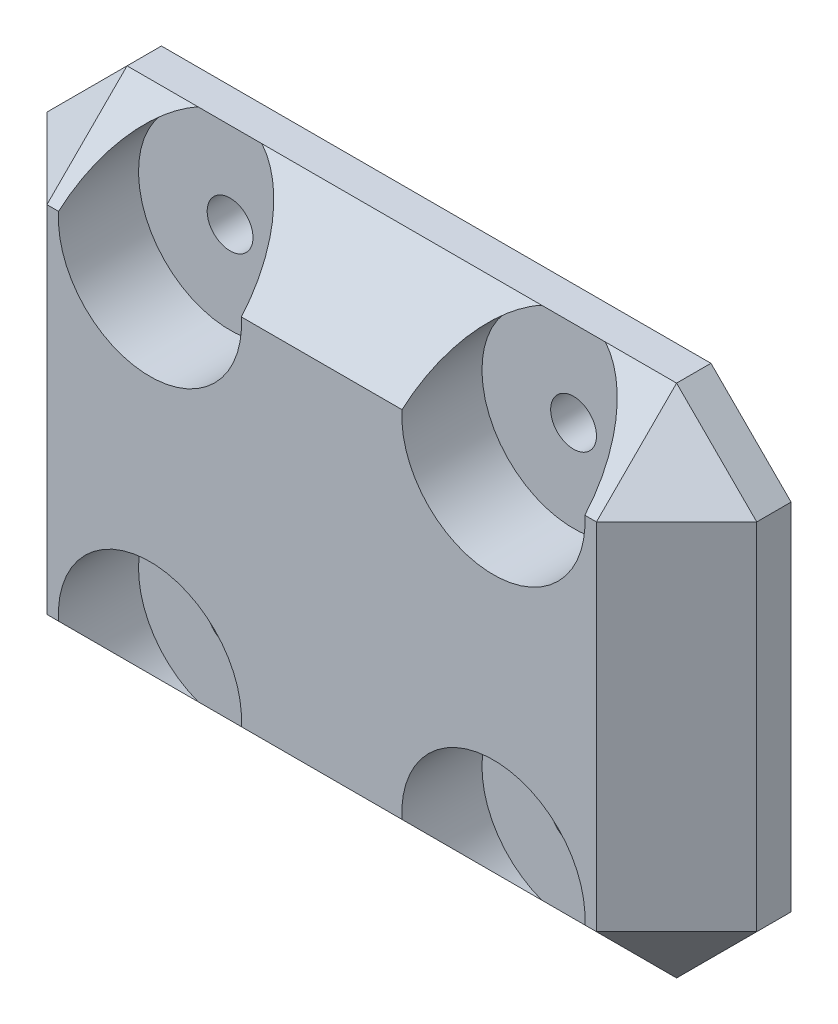
ISO-10303-21;
HEADER;
FILE_DESCRIPTION(('STEP AP214'),'2;1');
FILE_NAME('part.step','',(''),(''),'','','');
FILE_SCHEMA(('AUTOMOTIVE_DESIGN { 1 0 10303 214 1 1 1 1 }'));
ENDSEC;
DATA;
#1=APPLICATION_CONTEXT('core data for automotive mechanical design processes');
#2=APPLICATION_PROTOCOL_DEFINITION('international standard','automotive_design',2000,#1);
#3=PRODUCT_CONTEXT('',#1,'mechanical');
#4=PRODUCT('Part','Part','',(#3));
#5=PRODUCT_RELATED_PRODUCT_CATEGORY('part','',(#4));
#6=PRODUCT_DEFINITION_FORMATION('','',#4);
#7=PRODUCT_DEFINITION_CONTEXT('part definition',#1,'design');
#8=PRODUCT_DEFINITION('design','',#6,#7);
#9=PRODUCT_DEFINITION_SHAPE('','',#8);
#10=(LENGTH_UNIT() NAMED_UNIT(*) SI_UNIT(.MILLI.,.METRE.));
#11=(NAMED_UNIT(*) PLANE_ANGLE_UNIT() SI_UNIT($,.RADIAN.));
#12=(NAMED_UNIT(*) SI_UNIT($,.STERADIAN.) SOLID_ANGLE_UNIT());
#13=UNCERTAINTY_MEASURE_WITH_UNIT(LENGTH_MEASURE(1.E-05),#10,'distance_accuracy_value','');
#14=(GEOMETRIC_REPRESENTATION_CONTEXT(3) GLOBAL_UNCERTAINTY_ASSIGNED_CONTEXT((#13)) GLOBAL_UNIT_ASSIGNED_CONTEXT((#10,
#11,#12)) REPRESENTATION_CONTEXT('',''));
#15=CARTESIAN_POINT('',(0.,0.,0.));
#16=DIRECTION('',(0.,0.,1.));
#17=DIRECTION('',(1.,0.,0.));
#18=AXIS2_PLACEMENT_3D('',#15,#16,#17);
#19=CARTESIAN_POINT('',(-15.,-15.,10.));
#20=DIRECTION('',(0.,0.,-1.));
#21=DIRECTION('',(-1.,0.,0.));
#22=AXIS2_PLACEMENT_3D('',#19,#20,#21);
#23=CYLINDRICAL_SURFACE('',#22,2.);
#24=CARTESIAN_POINT('',(-15.,-15.,0.));
#25=DIRECTION('',(0.,0.,1.));
#26=DIRECTION('',(1.,0.,0.));
#27=AXIS2_PLACEMENT_3D('',#24,#25,#26);
#28=CIRCLE('',#27,2.);
#29=CARTESIAN_POINT('',(-13.,-15.,0.));
#30=VERTEX_POINT('',#29);
#31=EDGE_CURVE('E325',#30,#30,#28,.T.);
#32=ORIENTED_EDGE('',*,*,#31,.F.);
#33=EDGE_LOOP('',(#32));
#34=FACE_BOUND('',#33,.T.);
#35=CARTESIAN_POINT('',(-15.,-15.,3.));
#36=DIRECTION('',(0.,0.,1.));
#37=DIRECTION('',(1.,0.,0.));
#38=AXIS2_PLACEMENT_3D('',#35,#36,#37);
#39=CIRCLE('',#38,2.);
#40=CARTESIAN_POINT('',(-13.,-15.,3.));
#41=VERTEX_POINT('',#40);
#42=EDGE_CURVE('E304',#41,#41,#39,.T.);
#43=ORIENTED_EDGE('',*,*,#42,.T.);
#44=EDGE_LOOP('',(#43));
#45=FACE_BOUND('',#44,.T.);
#46=ADVANCED_FACE('F33',(#34,#45),#23,.F.);
#47=CARTESIAN_POINT('',(-15.,15.,10.));
#48=DIRECTION('',(0.,0.,-1.));
#49=DIRECTION('',(-1.,0.,0.));
#50=AXIS2_PLACEMENT_3D('',#47,#48,#49);
#51=CYLINDRICAL_SURFACE('',#50,2.);
#52=CARTESIAN_POINT('',(-15.,15.,0.));
#53=DIRECTION('',(0.,0.,1.));
#54=DIRECTION('',(1.,0.,0.));
#55=AXIS2_PLACEMENT_3D('',#52,#53,#54);
#56=CIRCLE('',#55,2.);
#57=CARTESIAN_POINT('',(-13.,15.,0.));
#58=VERTEX_POINT('',#57);
#59=EDGE_CURVE('E322',#58,#58,#56,.T.);
#60=ORIENTED_EDGE('',*,*,#59,.F.);
#61=EDGE_LOOP('',(#60));
#62=FACE_BOUND('',#61,.T.);
#63=CARTESIAN_POINT('',(-15.,15.,3.));
#64=DIRECTION('',(0.,0.,1.));
#65=DIRECTION('',(1.,0.,0.));
#66=AXIS2_PLACEMENT_3D('',#63,#64,#65);
#67=CIRCLE('',#66,2.);
#68=CARTESIAN_POINT('',(-13.,15.,3.));
#69=VERTEX_POINT('',#68);
#70=EDGE_CURVE('E312',#69,#69,#67,.T.);
#71=ORIENTED_EDGE('',*,*,#70,.T.);
#72=EDGE_LOOP('',(#71));
#73=FACE_BOUND('',#72,.T.);
#74=ADVANCED_FACE('F440',(#62,#73),#51,.F.);
#75=CARTESIAN_POINT('',(15.,15.,10.));
#76=DIRECTION('',(0.,0.,-1.));
#77=DIRECTION('',(-1.,0.,0.));
#78=AXIS2_PLACEMENT_3D('',#75,#76,#77);
#79=CYLINDRICAL_SURFACE('',#78,2.);
#80=CARTESIAN_POINT('',(15.,15.,0.));
#81=DIRECTION('',(0.,0.,1.));
#82=DIRECTION('',(1.,0.,0.));
#83=AXIS2_PLACEMENT_3D('',#80,#81,#82);
#84=CIRCLE('',#83,2.);
#85=CARTESIAN_POINT('',(17.,15.,0.));
#86=VERTEX_POINT('',#85);
#87=EDGE_CURVE('E319',#86,#86,#84,.T.);
#88=ORIENTED_EDGE('',*,*,#87,.F.);
#89=EDGE_LOOP('',(#88));
#90=FACE_BOUND('',#89,.T.);
#91=CARTESIAN_POINT('',(15.,15.,3.));
#92=DIRECTION('',(0.,0.,1.));
#93=DIRECTION('',(1.,0.,0.));
#94=AXIS2_PLACEMENT_3D('',#91,#92,#93);
#95=CIRCLE('',#94,2.);
#96=CARTESIAN_POINT('',(17.,15.,3.));
#97=VERTEX_POINT('',#96);
#98=EDGE_CURVE('E237',#97,#97,#95,.T.);
#99=ORIENTED_EDGE('',*,*,#98,.T.);
#100=EDGE_LOOP('',(#99));
#101=FACE_BOUND('',#100,.T.);
#102=ADVANCED_FACE('F446',(#90,#101),#79,.F.);
#103=CARTESIAN_POINT('',(15.,-15.,10.));
#104=DIRECTION('',(0.,0.,-1.));
#105=DIRECTION('',(-1.,0.,0.));
#106=AXIS2_PLACEMENT_3D('',#103,#104,#105);
#107=CYLINDRICAL_SURFACE('',#106,2.);
#108=CARTESIAN_POINT('',(15.,-15.,0.));
#109=DIRECTION('',(0.,0.,1.));
#110=DIRECTION('',(1.,0.,0.));
#111=AXIS2_PLACEMENT_3D('',#108,#109,#110);
#112=CIRCLE('',#111,2.);
#113=CARTESIAN_POINT('',(17.,-15.,0.));
#114=VERTEX_POINT('',#113);
#115=EDGE_CURVE('E268',#114,#114,#112,.T.);
#116=ORIENTED_EDGE('',*,*,#115,.F.);
#117=EDGE_LOOP('',(#116));
#118=FACE_BOUND('',#117,.T.);
#119=CARTESIAN_POINT('',(15.,-15.,3.));
#120=DIRECTION('',(0.,0.,1.));
#121=DIRECTION('',(1.,0.,0.));
#122=AXIS2_PLACEMENT_3D('',#119,#120,#121);
#123=CIRCLE('',#122,2.);
#124=CARTESIAN_POINT('',(17.,-15.,3.));
#125=VERTEX_POINT('',#124);
#126=EDGE_CURVE('E309',#125,#125,#123,.T.);
#127=ORIENTED_EDGE('',*,*,#126,.T.);
#128=EDGE_LOOP('',(#127));
#129=FACE_BOUND('',#128,.T.);
#130=ADVANCED_FACE('F494',(#118,#129),#107,.F.);
#131=CARTESIAN_POINT('',(0.,15.5,10.));
#132=DIRECTION('',(0.,-0.707106781186546,-0.707106781186549));
#133=DIRECTION('',(-1.,0.,0.));
#134=AXIS2_PLACEMENT_3D('',#131,#132,#133);
#135=PLANE('',#134);
#136=CARTESIAN_POINT('',(15.,15.,10.5));
#137=DIRECTION('',(0.,-0.707106781186546,-0.707106781186549));
#138=DIRECTION('',(0.,-0.707106781186549,0.707106781186546));
#139=AXIS2_PLACEMENT_3D('',#136,#137,#138);
#140=ELLIPSE('',#139,11.3137084989847,8.);
#141=CARTESIAN_POINT('',(22.9843597113357,15.5,10.));
#142=VERTEX_POINT('',#141);
#143=CARTESIAN_POINT('',(17.783882181415,22.5,3.00000000000001));
#144=VERTEX_POINT('',#143);
#145=EDGE_CURVE('E11',#142,#144,#140,.F.);
#146=ORIENTED_EDGE('',*,*,#145,.F.);
#147=DIRECTION('',(-1.,0.,0.));
#148=VECTOR('',#147,1.);
#149=CARTESIAN_POINT('',(0.,15.5,10.));
#150=LINE('',#149,#148);
#151=CARTESIAN_POINT('',(24.,15.5,10.));
#152=VERTEX_POINT('',#151);
#153=EDGE_CURVE('E342',#152,#142,#150,.T.);
#154=ORIENTED_EDGE('',*,*,#153,.F.);
#155=DIRECTION('',(0.,0.707106781186549,-0.707106781186546));
#156=VECTOR('',#155,1.);
#157=CARTESIAN_POINT('',(24.,22.5,3.00000000000001));
#158=LINE('',#157,#156);
#159=CARTESIAN_POINT('',(24.,22.5,3.00000000000001));
#160=VERTEX_POINT('',#159);
#161=EDGE_CURVE('E260',#160,#152,#158,.F.);
#162=ORIENTED_EDGE('',*,*,#161,.F.);
#163=DIRECTION('',(1.,0.,0.));
#164=VECTOR('',#163,1.);
#165=CARTESIAN_POINT('',(-31.,22.5,3.00000000000001));
#166=LINE('',#165,#164);
#167=EDGE_CURVE('E220',#144,#160,#166,.T.);
#168=ORIENTED_EDGE('',*,*,#167,.F.);
#169=EDGE_LOOP('',(#146,#154,#162,#168));
#170=FACE_BOUND('',#169,.T.);
#171=ADVANCED_FACE('F395',(#170),#135,.F.);
#172=CARTESIAN_POINT('',(12.216117818585,22.5,3.));
#173=VERTEX_POINT('',#172);
#174=CARTESIAN_POINT('',(7.01564028866434,15.5,10.));
#175=VERTEX_POINT('',#174);
#176=EDGE_CURVE('E37',#173,#175,#140,.F.);
#177=ORIENTED_EDGE('',*,*,#176,.F.);
#178=CARTESIAN_POINT('',(-12.216117818585,22.5,3.00000000000001));
#179=VERTEX_POINT('',#178);
#180=EDGE_CURVE('E416',#179,#173,#166,.T.);
#181=ORIENTED_EDGE('',*,*,#180,.F.);
#182=CARTESIAN_POINT('',(-15.,15.,10.5));
#183=DIRECTION('',(0.,-0.707106781186546,-0.707106781186549));
#184=DIRECTION('',(0.,-0.707106781186549,0.707106781186546));
#185=AXIS2_PLACEMENT_3D('',#182,#183,#184);
#186=ELLIPSE('',#185,11.3137084989847,8.);
#187=CARTESIAN_POINT('',(-7.01564028866434,15.5,10.));
#188=VERTEX_POINT('',#187);
#189=EDGE_CURVE('E272',#188,#179,#186,.F.);
#190=ORIENTED_EDGE('',*,*,#189,.F.);
#191=DIRECTION('',(-1.,0.,0.));
#192=VECTOR('',#191,1.);
#193=CARTESIAN_POINT('',(0.,15.5,10.));
#194=LINE('',#193,#192);
#195=EDGE_CURVE('E186',#175,#188,#194,.T.);
#196=ORIENTED_EDGE('',*,*,#195,.F.);
#197=EDGE_LOOP('',(#177,#181,#190,#196));
#198=FACE_BOUND('',#197,.T.);
#199=ADVANCED_FACE('F424',(#198),#135,.F.);
#200=CARTESIAN_POINT('',(0.,-15.5,10.));
#201=DIRECTION('',(0.,0.707106781186549,-0.707106781186546));
#202=DIRECTION('',(1.,0.,0.));
#203=AXIS2_PLACEMENT_3D('',#200,#201,#202);
#204=PLANE('',#203);
#205=CARTESIAN_POINT('',(15.,-15.,10.5));
#206=DIRECTION('',(0.,0.707106781186549,-0.707106781186546));
#207=DIRECTION('',(0.,0.707106781186546,0.707106781186549));
#208=AXIS2_PLACEMENT_3D('',#205,#206,#207);
#209=ELLIPSE('',#208,11.3137084989848,8.);
#210=CARTESIAN_POINT('',(7.01564028866435,-15.5,10.));
#211=VERTEX_POINT('',#210);
#212=CARTESIAN_POINT('',(12.2161178185849,-22.5,2.99999999999999));
#213=VERTEX_POINT('',#212);
#214=EDGE_CURVE('E270',#211,#213,#209,.F.);
#215=ORIENTED_EDGE('',*,*,#214,.F.);
#216=DIRECTION('',(1.,0.,0.));
#217=VECTOR('',#216,1.);
#218=CARTESIAN_POINT('',(0.,-15.5,10.));
#219=LINE('',#218,#217);
#220=CARTESIAN_POINT('',(-7.01564028866434,-15.5,10.));
#221=VERTEX_POINT('',#220);
#222=EDGE_CURVE('E189',#221,#211,#219,.T.);
#223=ORIENTED_EDGE('',*,*,#222,.F.);
#224=CARTESIAN_POINT('',(-15.,-15.,10.5));
#225=DIRECTION('',(0.,0.707106781186549,-0.707106781186546));
#226=DIRECTION('',(0.,0.707106781186546,0.707106781186549));
#227=AXIS2_PLACEMENT_3D('',#224,#225,#226);
#228=ELLIPSE('',#227,11.3137084989848,8.);
#229=CARTESIAN_POINT('',(-12.2161178185849,-22.5,3.));
#230=VERTEX_POINT('',#229);
#231=EDGE_CURVE('E164',#230,#221,#228,.F.);
#232=ORIENTED_EDGE('',*,*,#231,.F.);
#233=DIRECTION('',(-1.,0.,0.));
#234=VECTOR('',#233,1.);
#235=CARTESIAN_POINT('',(-31.,-22.5,2.99999999999999));
#236=LINE('',#235,#234);
#237=EDGE_CURVE('E287',#213,#230,#236,.T.);
#238=ORIENTED_EDGE('',*,*,#237,.F.);
#239=EDGE_LOOP('',(#215,#223,#232,#238));
#240=FACE_BOUND('',#239,.T.);
#241=ADVANCED_FACE('F289',(#240),#204,.F.);
#242=CARTESIAN_POINT('',(-22.9843597113357,-15.5,10.));
#243=VERTEX_POINT('',#242);
#244=CARTESIAN_POINT('',(-17.7838821814151,-22.5,2.99999999999999));
#245=VERTEX_POINT('',#244);
#246=EDGE_CURVE('E161',#243,#245,#228,.F.);
#247=ORIENTED_EDGE('',*,*,#246,.F.);
#248=DIRECTION('',(1.,0.,0.));
#249=VECTOR('',#248,1.);
#250=CARTESIAN_POINT('',(0.,-15.5,10.));
#251=LINE('',#250,#249);
#252=CARTESIAN_POINT('',(-24.,-15.5,10.));
#253=VERTEX_POINT('',#252);
#254=EDGE_CURVE('E176',#253,#243,#251,.T.);
#255=ORIENTED_EDGE('',*,*,#254,.F.);
#256=DIRECTION('',(0.,-0.707106781186546,-0.707106781186549));
#257=VECTOR('',#256,1.);
#258=CARTESIAN_POINT('',(-24.,-22.5,2.99999999999999));
#259=LINE('',#258,#257);
#260=CARTESIAN_POINT('',(-24.,-22.5,2.99999999999999));
#261=VERTEX_POINT('',#260);
#262=EDGE_CURVE('E236',#253,#261,#259,.T.);
#263=ORIENTED_EDGE('',*,*,#262,.T.);
#264=EDGE_CURVE('E177',#245,#261,#236,.T.);
#265=ORIENTED_EDGE('',*,*,#264,.F.);
#266=EDGE_LOOP('',(#247,#255,#263,#265));
#267=FACE_BOUND('',#266,.T.);
#268=ADVANCED_FACE('F174',(#267),#204,.F.);
#269=CARTESIAN_POINT('',(0.,0.,10.));
#270=DIRECTION('',(0.,0.,-1.));
#271=DIRECTION('',(-1.,0.,0.));
#272=AXIS2_PLACEMENT_3D('',#269,#270,#271);
#273=PLANE('',#272);
#274=ORIENTED_EDGE('',*,*,#153,.T.);
#275=CARTESIAN_POINT('',(15.,15.,10.));
#276=DIRECTION('',(0.,0.,1.));
#277=DIRECTION('',(1.,0.,0.));
#278=AXIS2_PLACEMENT_3D('',#275,#276,#277);
#279=CIRCLE('',#278,8.);
#280=EDGE_CURVE('E301',#175,#142,#279,.T.);
#281=ORIENTED_EDGE('',*,*,#280,.F.);
#282=ORIENTED_EDGE('',*,*,#195,.T.);
#283=CARTESIAN_POINT('',(-15.,15.,10.));
#284=DIRECTION('',(0.,0.,1.));
#285=DIRECTION('',(1.,0.,0.));
#286=AXIS2_PLACEMENT_3D('',#283,#284,#285);
#287=CIRCLE('',#286,8.);
#288=CARTESIAN_POINT('',(-22.9843597113357,15.5,10.));
#289=VERTEX_POINT('',#288);
#290=EDGE_CURVE('E305',#289,#188,#287,.T.);
#291=ORIENTED_EDGE('',*,*,#290,.F.);
#292=DIRECTION('',(-1.,0.,0.));
#293=VECTOR('',#292,1.);
#294=CARTESIAN_POINT('',(0.,15.5,10.));
#295=LINE('',#294,#293);
#296=CARTESIAN_POINT('',(-24.,15.5,10.));
#297=VERTEX_POINT('',#296);
#298=EDGE_CURVE('E191',#289,#297,#295,.T.);
#299=ORIENTED_EDGE('',*,*,#298,.T.);
#300=DIRECTION('',(0.,-1.,0.));
#301=VECTOR('',#300,1.);
#302=CARTESIAN_POINT('',(-24.,0.,10.));
#303=LINE('',#302,#301);
#304=EDGE_CURVE('E184',#297,#253,#303,.T.);
#305=ORIENTED_EDGE('',*,*,#304,.T.);
#306=ORIENTED_EDGE('',*,*,#254,.T.);
#307=CARTESIAN_POINT('',(-15.,-15.,10.));
#308=DIRECTION('',(0.,0.,1.));
#309=DIRECTION('',(1.,0.,0.));
#310=AXIS2_PLACEMENT_3D('',#307,#308,#309);
#311=CIRCLE('',#310,8.);
#312=EDGE_CURVE('E157',#221,#243,#311,.T.);
#313=ORIENTED_EDGE('',*,*,#312,.F.);
#314=ORIENTED_EDGE('',*,*,#222,.T.);
#315=CARTESIAN_POINT('',(15.,-15.,10.));
#316=DIRECTION('',(0.,0.,1.));
#317=DIRECTION('',(1.,0.,0.));
#318=AXIS2_PLACEMENT_3D('',#315,#316,#317);
#319=CIRCLE('',#318,8.);
#320=CARTESIAN_POINT('',(22.9843597113357,-15.5,10.));
#321=VERTEX_POINT('',#320);
#322=EDGE_CURVE('E284',#321,#211,#319,.T.);
#323=ORIENTED_EDGE('',*,*,#322,.F.);
#324=DIRECTION('',(1.,0.,0.));
#325=VECTOR('',#324,1.);
#326=CARTESIAN_POINT('',(0.,-15.5,10.));
#327=LINE('',#326,#325);
#328=CARTESIAN_POINT('',(24.,-15.5,10.));
#329=VERTEX_POINT('',#328);
#330=EDGE_CURVE('E344',#321,#329,#327,.T.);
#331=ORIENTED_EDGE('',*,*,#330,.T.);
#332=DIRECTION('',(0.,1.,0.));
#333=VECTOR('',#332,1.);
#334=CARTESIAN_POINT('',(24.,0.,10.));
#335=LINE('',#334,#333);
#336=EDGE_CURVE('E340',#329,#152,#335,.T.);
#337=ORIENTED_EDGE('',*,*,#336,.T.);
#338=EDGE_LOOP('',(#274,#281,#282,#291,#299,#305,#306,#313,#314,#323,#331,#337));
#339=FACE_BOUND('',#338,.T.);
#340=ADVANCED_FACE('F182',(#339),#273,.F.);
#341=CARTESIAN_POINT('',(0.,0.,0.));
#342=DIRECTION('',(0.,0.,-1.));
#343=DIRECTION('',(-1.,0.,0.));
#344=AXIS2_PLACEMENT_3D('',#341,#342,#343);
#345=PLANE('',#344);
#346=ORIENTED_EDGE('',*,*,#87,.T.);
#347=EDGE_LOOP('',(#346));
#348=FACE_BOUND('',#347,.T.);
#349=ORIENTED_EDGE('',*,*,#31,.T.);
#350=EDGE_LOOP('',(#349));
#351=FACE_BOUND('',#350,.T.);
#352=DIRECTION('',(1.,0.,0.));
#353=VECTOR('',#352,1.);
#354=CARTESIAN_POINT('',(-31.,-22.5,0.));
#355=LINE('',#354,#353);
#356=CARTESIAN_POINT('',(-24.,-22.5,0.));
#357=VERTEX_POINT('',#356);
#358=CARTESIAN_POINT('',(24.,-22.5,0.));
#359=VERTEX_POINT('',#358);
#360=EDGE_CURVE('E337',#357,#359,#355,.T.);
#361=ORIENTED_EDGE('',*,*,#360,.F.);
#362=DIRECTION('',(0.707106781186546,-0.707106781186549,0.));
#363=VECTOR('',#362,1.);
#364=CARTESIAN_POINT('',(-23.25,-23.25,0.));
#365=LINE('',#364,#363);
#366=CARTESIAN_POINT('',(-31.,-15.5,0.));
#367=VERTEX_POINT('',#366);
#368=EDGE_CURVE('E210',#357,#367,#365,.F.);
#369=ORIENTED_EDGE('',*,*,#368,.T.);
#370=DIRECTION('',(0.,-1.,0.));
#371=VECTOR('',#370,1.);
#372=CARTESIAN_POINT('',(-31.,-22.5,0.));
#373=LINE('',#372,#371);
#374=CARTESIAN_POINT('',(-31.,15.5,0.));
#375=VERTEX_POINT('',#374);
#376=EDGE_CURVE('E334',#375,#367,#373,.T.);
#377=ORIENTED_EDGE('',*,*,#376,.F.);
#378=DIRECTION('',(-0.707106781186546,-0.707106781186549,0.));
#379=VECTOR('',#378,1.);
#380=CARTESIAN_POINT('',(-23.25,23.25,0.));
#381=LINE('',#380,#379);
#382=CARTESIAN_POINT('',(-24.,22.5,0.));
#383=VERTEX_POINT('',#382);
#384=EDGE_CURVE('E208',#375,#383,#381,.F.);
#385=ORIENTED_EDGE('',*,*,#384,.T.);
#386=DIRECTION('',(-1.,0.,0.));
#387=VECTOR('',#386,1.);
#388=CARTESIAN_POINT('',(-31.,22.5,0.));
#389=LINE('',#388,#387);
#390=CARTESIAN_POINT('',(24.,22.5,0.));
#391=VERTEX_POINT('',#390);
#392=EDGE_CURVE('E331',#391,#383,#389,.T.);
#393=ORIENTED_EDGE('',*,*,#392,.F.);
#394=DIRECTION('',(-0.707106781186546,0.707106781186549,0.));
#395=VECTOR('',#394,1.);
#396=CARTESIAN_POINT('',(23.25,23.25,0.));
#397=LINE('',#396,#395);
#398=CARTESIAN_POINT('',(31.,15.5,0.));
#399=VERTEX_POINT('',#398);
#400=EDGE_CURVE('E204',#391,#399,#397,.F.);
#401=ORIENTED_EDGE('',*,*,#400,.T.);
#402=DIRECTION('',(0.,1.,0.));
#403=VECTOR('',#402,1.);
#404=CARTESIAN_POINT('',(31.,-22.5,0.));
#405=LINE('',#404,#403);
#406=CARTESIAN_POINT('',(31.,-15.5,0.));
#407=VERTEX_POINT('',#406);
#408=EDGE_CURVE('E328',#407,#399,#405,.T.);
#409=ORIENTED_EDGE('',*,*,#408,.F.);
#410=DIRECTION('',(0.707106781186546,0.707106781186549,0.));
#411=VECTOR('',#410,1.);
#412=CARTESIAN_POINT('',(23.25,-23.25,0.));
#413=LINE('',#412,#411);
#414=EDGE_CURVE('E206',#407,#359,#413,.F.);
#415=ORIENTED_EDGE('',*,*,#414,.T.);
#416=EDGE_LOOP('',(#361,#369,#377,#385,#393,#401,#409,#415));
#417=FACE_BOUND('',#416,.T.);
#418=ORIENTED_EDGE('',*,*,#59,.T.);
#419=EDGE_LOOP('',(#418));
#420=FACE_BOUND('',#419,.T.);
#421=ORIENTED_EDGE('',*,*,#115,.T.);
#422=EDGE_LOOP('',(#421));
#423=FACE_BOUND('',#422,.T.);
#424=ADVANCED_FACE('F369',(#348,#351,#417,#420,#423),#345,.T.);
#425=CARTESIAN_POINT('',(31.,-22.5,10.));
#426=DIRECTION('',(-1.,0.,0.));
#427=DIRECTION('',(0.,0.,1.));
#428=AXIS2_PLACEMENT_3D('',#425,#426,#427);
#429=PLANE('',#428);
#430=DIRECTION('',(0.,-1.,0.));
#431=VECTOR('',#430,1.);
#432=CARTESIAN_POINT('',(31.,-22.5,2.99999999999999));
#433=LINE('',#432,#431);
#434=CARTESIAN_POINT('',(31.,15.5,2.99999999999999));
#435=VERTEX_POINT('',#434);
#436=CARTESIAN_POINT('',(31.,-15.5,2.99999999999999));
#437=VERTEX_POINT('',#436);
#438=EDGE_CURVE('E229',#435,#437,#433,.T.);
#439=ORIENTED_EDGE('',*,*,#438,.T.);
#440=DIRECTION('',(0.,0.,-1.));
#441=VECTOR('',#440,1.);
#442=CARTESIAN_POINT('',(31.,-15.5,10.));
#443=LINE('',#442,#441);
#444=EDGE_CURVE('E231',#437,#407,#443,.T.);
#445=ORIENTED_EDGE('',*,*,#444,.T.);
#446=ORIENTED_EDGE('',*,*,#408,.T.);
#447=DIRECTION('',(0.,0.,1.));
#448=VECTOR('',#447,1.);
#449=CARTESIAN_POINT('',(31.,15.5,10.));
#450=LINE('',#449,#448);
#451=EDGE_CURVE('E227',#399,#435,#450,.T.);
#452=ORIENTED_EDGE('',*,*,#451,.T.);
#453=EDGE_LOOP('',(#439,#445,#446,#452));
#454=FACE_BOUND('',#453,.T.);
#455=ADVANCED_FACE('F457',(#454),#429,.F.);
#456=CARTESIAN_POINT('',(-31.,22.5,10.));
#457=DIRECTION('',(0.,-1.,0.));
#458=DIRECTION('',(0.,0.,-1.));
#459=AXIS2_PLACEMENT_3D('',#456,#457,#458);
#460=PLANE('',#459);
#461=ORIENTED_EDGE('',*,*,#392,.T.);
#462=DIRECTION('',(0.,0.,1.));
#463=VECTOR('',#462,1.);
#464=CARTESIAN_POINT('',(-24.,22.5,10.));
#465=LINE('',#464,#463);
#466=CARTESIAN_POINT('',(-24.,22.5,3.00000000000001));
#467=VERTEX_POINT('',#466);
#468=EDGE_CURVE('E224',#383,#467,#465,.T.);
#469=ORIENTED_EDGE('',*,*,#468,.T.);
#470=CARTESIAN_POINT('',(-17.783882181415,22.5,3.));
#471=VERTEX_POINT('',#470);
#472=EDGE_CURVE('E221',#467,#471,#166,.T.);
#473=ORIENTED_EDGE('',*,*,#472,.T.);
#474=EDGE_CURVE('E225',#471,#179,#166,.T.);
#475=ORIENTED_EDGE('',*,*,#474,.T.);
#476=ORIENTED_EDGE('',*,*,#180,.T.);
#477=EDGE_CURVE('E417',#173,#144,#166,.T.);
#478=ORIENTED_EDGE('',*,*,#477,.T.);
#479=ORIENTED_EDGE('',*,*,#167,.T.);
#480=DIRECTION('',(0.,0.,-1.));
#481=VECTOR('',#480,1.);
#482=CARTESIAN_POINT('',(24.,22.5,10.));
#483=LINE('',#482,#481);
#484=EDGE_CURVE('E218',#160,#391,#483,.T.);
#485=ORIENTED_EDGE('',*,*,#484,.T.);
#486=EDGE_LOOP('',(#461,#469,#473,#475,#476,#478,#479,#485));
#487=FACE_BOUND('',#486,.T.);
#488=ADVANCED_FACE('F407',(#487),#460,.F.);
#489=CARTESIAN_POINT('',(-31.,-22.5,10.));
#490=DIRECTION('',(1.,0.,0.));
#491=DIRECTION('',(0.,0.,-1.));
#492=AXIS2_PLACEMENT_3D('',#489,#490,#491);
#493=PLANE('',#492);
#494=ORIENTED_EDGE('',*,*,#376,.T.);
#495=DIRECTION('',(0.,0.,1.));
#496=VECTOR('',#495,1.);
#497=CARTESIAN_POINT('',(-31.,-15.5,10.));
#498=LINE('',#497,#496);
#499=CARTESIAN_POINT('',(-31.,-15.5,2.99999999999999));
#500=VERTEX_POINT('',#499);
#501=EDGE_CURVE('E216',#367,#500,#498,.T.);
#502=ORIENTED_EDGE('',*,*,#501,.T.);
#503=DIRECTION('',(0.,1.,0.));
#504=VECTOR('',#503,1.);
#505=CARTESIAN_POINT('',(-31.,-22.5,2.99999999999999));
#506=LINE('',#505,#504);
#507=CARTESIAN_POINT('',(-31.,15.5,2.99999999999999));
#508=VERTEX_POINT('',#507);
#509=EDGE_CURVE('E214',#500,#508,#506,.T.);
#510=ORIENTED_EDGE('',*,*,#509,.T.);
#511=DIRECTION('',(0.,0.,-1.));
#512=VECTOR('',#511,1.);
#513=CARTESIAN_POINT('',(-31.,15.5,10.));
#514=LINE('',#513,#512);
#515=EDGE_CURVE('E212',#508,#375,#514,.T.);
#516=ORIENTED_EDGE('',*,*,#515,.T.);
#517=EDGE_LOOP('',(#494,#502,#510,#516));
#518=FACE_BOUND('',#517,.T.);
#519=ADVANCED_FACE('F461',(#518),#493,.F.);
#520=CARTESIAN_POINT('',(-31.,-22.5,10.));
#521=DIRECTION('',(0.,1.,0.));
#522=DIRECTION('',(0.,0.,1.));
#523=AXIS2_PLACEMENT_3D('',#520,#521,#522);
#524=PLANE('',#523);
#525=CARTESIAN_POINT('',(24.,-22.5,2.99999999999999));
#526=VERTEX_POINT('',#525);
#527=CARTESIAN_POINT('',(17.7838821814151,-22.5,3.));
#528=VERTEX_POINT('',#527);
#529=EDGE_CURVE('E198',#526,#528,#236,.T.);
#530=ORIENTED_EDGE('',*,*,#529,.T.);
#531=EDGE_CURVE('E202',#528,#213,#236,.T.);
#532=ORIENTED_EDGE('',*,*,#531,.T.);
#533=ORIENTED_EDGE('',*,*,#237,.T.);
#534=EDGE_CURVE('E291',#230,#245,#236,.T.);
#535=ORIENTED_EDGE('',*,*,#534,.T.);
#536=ORIENTED_EDGE('',*,*,#264,.T.);
#537=DIRECTION('',(0.,0.,-1.));
#538=VECTOR('',#537,1.);
#539=CARTESIAN_POINT('',(-24.,-22.5,10.));
#540=LINE('',#539,#538);
#541=EDGE_CURVE('E201',#261,#357,#540,.T.);
#542=ORIENTED_EDGE('',*,*,#541,.T.);
#543=ORIENTED_EDGE('',*,*,#360,.T.);
#544=DIRECTION('',(0.,0.,1.));
#545=VECTOR('',#544,1.);
#546=CARTESIAN_POINT('',(24.,-22.5,10.));
#547=LINE('',#546,#545);
#548=EDGE_CURVE('E196',#359,#526,#547,.T.);
#549=ORIENTED_EDGE('',*,*,#548,.T.);
#550=EDGE_LOOP('',(#530,#532,#533,#535,#536,#542,#543,#549));
#551=FACE_BOUND('',#550,.T.);
#552=ADVANCED_FACE('F292',(#551),#524,.F.);
#553=CARTESIAN_POINT('',(-31.,15.5,10.));
#554=DIRECTION('',(0.707106781186549,-0.707106781186546,0.));
#555=DIRECTION('',(0.,0.,-1.));
#556=AXIS2_PLACEMENT_3D('',#553,#554,#555);
#557=PLANE('',#556);
#558=ORIENTED_EDGE('',*,*,#384,.F.);
#559=ORIENTED_EDGE('',*,*,#515,.F.);
#560=DIRECTION('',(0.707106781186546,0.707106781186549,0.));
#561=VECTOR('',#560,1.);
#562=CARTESIAN_POINT('',(-31.,15.5,2.99999999999999));
#563=LINE('',#562,#561);
#564=EDGE_CURVE('E266',#467,#508,#563,.F.);
#565=ORIENTED_EDGE('',*,*,#564,.F.);
#566=ORIENTED_EDGE('',*,*,#468,.F.);
#567=EDGE_LOOP('',(#558,#559,#565,#566));
#568=FACE_BOUND('',#567,.T.);
#569=ADVANCED_FACE('F35',(#568),#557,.F.);
#570=EDGE_CURVE('E271',#471,#289,#186,.F.);
#571=ORIENTED_EDGE('',*,*,#570,.F.);
#572=ORIENTED_EDGE('',*,*,#472,.F.);
#573=DIRECTION('',(0.,-0.707106781186549,0.707106781186546));
#574=VECTOR('',#573,1.);
#575=CARTESIAN_POINT('',(-24.,19.,6.5));
#576=LINE('',#575,#574);
#577=EDGE_CURVE('E263',#297,#467,#576,.F.);
#578=ORIENTED_EDGE('',*,*,#577,.F.);
#579=ORIENTED_EDGE('',*,*,#298,.F.);
#580=EDGE_LOOP('',(#571,#572,#578,#579));
#581=FACE_BOUND('',#580,.T.);
#582=ADVANCED_FACE('F350',(#581),#135,.F.);
#583=CARTESIAN_POINT('',(24.,22.5,10.));
#584=DIRECTION('',(-0.707106781186549,-0.707106781186546,0.));
#585=DIRECTION('',(0.,0.,-1.));
#586=AXIS2_PLACEMENT_3D('',#583,#584,#585);
#587=PLANE('',#586);
#588=ORIENTED_EDGE('',*,*,#400,.F.);
#589=ORIENTED_EDGE('',*,*,#484,.F.);
#590=DIRECTION('',(0.707106781186546,-0.707106781186549,0.));
#591=VECTOR('',#590,1.);
#592=CARTESIAN_POINT('',(24.,22.5,3.00000000000001));
#593=LINE('',#592,#591);
#594=EDGE_CURVE('E257',#435,#160,#593,.F.);
#595=ORIENTED_EDGE('',*,*,#594,.F.);
#596=ORIENTED_EDGE('',*,*,#451,.F.);
#597=EDGE_LOOP('',(#588,#589,#595,#596));
#598=FACE_BOUND('',#597,.T.);
#599=ADVANCED_FACE('F404',(#598),#587,.F.);
#600=CARTESIAN_POINT('',(-31.,15.5,2.99999999999999));
#601=DIRECTION('',(-0.577350269189627,0.577350269189624,0.577350269189626));
#602=DIRECTION('',(0.707106781186547,0.,0.707106781186549));
#603=AXIS2_PLACEMENT_3D('',#600,#601,#602);
#604=PLANE('',#603);
#605=ORIENTED_EDGE('',*,*,#577,.T.);
#606=ORIENTED_EDGE('',*,*,#564,.T.);
#607=DIRECTION('',(-0.707106781186546,0.,-0.707106781186549));
#608=VECTOR('',#607,1.);
#609=CARTESIAN_POINT('',(-31.,15.5,2.99999999999999));
#610=LINE('',#609,#608);
#611=EDGE_CURVE('E254',#297,#508,#610,.T.);
#612=ORIENTED_EDGE('',*,*,#611,.F.);
#613=EDGE_LOOP('',(#605,#606,#612));
#614=FACE_BOUND('',#613,.T.);
#615=ADVANCED_FACE('F353',(#614),#604,.T.);
#616=CARTESIAN_POINT('',(24.,22.5,3.00000000000001));
#617=DIRECTION('',(0.577350269189628,0.577350269189624,0.577350269189626));
#618=DIRECTION('',(0.707106781186546,0.,-0.707106781186549));
#619=AXIS2_PLACEMENT_3D('',#616,#617,#618);
#620=PLANE('',#619);
#621=ORIENTED_EDGE('',*,*,#594,.T.);
#622=ORIENTED_EDGE('',*,*,#161,.T.);
#623=DIRECTION('',(-0.707106781186546,0.,0.707106781186549));
#624=VECTOR('',#623,1.);
#625=CARTESIAN_POINT('',(27.5,15.5,6.49999999999999));
#626=LINE('',#625,#624);
#627=EDGE_CURVE('E251',#435,#152,#626,.T.);
#628=ORIENTED_EDGE('',*,*,#627,.F.);
#629=EDGE_LOOP('',(#621,#622,#628));
#630=FACE_BOUND('',#629,.T.);
#631=ADVANCED_FACE('F398',(#630),#620,.T.);
#632=CARTESIAN_POINT('',(-24.,-22.5,10.));
#633=DIRECTION('',(0.707106781186549,0.707106781186546,0.));
#634=DIRECTION('',(0.,0.,-1.));
#635=AXIS2_PLACEMENT_3D('',#632,#633,#634);
#636=PLANE('',#635);
#637=ORIENTED_EDGE('',*,*,#368,.F.);
#638=ORIENTED_EDGE('',*,*,#541,.F.);
#639=DIRECTION('',(-0.707106781186546,0.707106781186549,0.));
#640=VECTOR('',#639,1.);
#641=CARTESIAN_POINT('',(-24.,-22.5,2.99999999999999));
#642=LINE('',#641,#640);
#643=EDGE_CURVE('E248',#500,#261,#642,.F.);
#644=ORIENTED_EDGE('',*,*,#643,.F.);
#645=ORIENTED_EDGE('',*,*,#501,.F.);
#646=EDGE_LOOP('',(#637,#638,#644,#645));
#647=FACE_BOUND('',#646,.T.);
#648=ADVANCED_FACE('F365',(#647),#636,.F.);
#649=CARTESIAN_POINT('',(-24.,0.,10.));
#650=DIRECTION('',(0.707106781186549,0.,-0.707106781186546));
#651=DIRECTION('',(0.,-1.,0.));
#652=AXIS2_PLACEMENT_3D('',#649,#650,#651);
#653=PLANE('',#652);
#654=ORIENTED_EDGE('',*,*,#611,.T.);
#655=ORIENTED_EDGE('',*,*,#509,.F.);
#656=DIRECTION('',(0.707106781186546,0.,0.707106781186549));
#657=VECTOR('',#656,1.);
#658=CARTESIAN_POINT('',(-27.5,-15.5,6.49999999999999));
#659=LINE('',#658,#657);
#660=EDGE_CURVE('E245',#253,#500,#659,.F.);
#661=ORIENTED_EDGE('',*,*,#660,.F.);
#662=ORIENTED_EDGE('',*,*,#304,.F.);
#663=EDGE_LOOP('',(#654,#655,#661,#662));
#664=FACE_BOUND('',#663,.T.);
#665=ADVANCED_FACE('F356',(#664),#653,.F.);
#666=CARTESIAN_POINT('',(24.,0.,10.));
#667=DIRECTION('',(-0.707106781186549,0.,-0.707106781186546));
#668=DIRECTION('',(0.,1.,0.));
#669=AXIS2_PLACEMENT_3D('',#666,#667,#668);
#670=PLANE('',#669);
#671=ORIENTED_EDGE('',*,*,#627,.T.);
#672=ORIENTED_EDGE('',*,*,#336,.F.);
#673=DIRECTION('',(0.707106781186546,0.,-0.707106781186549));
#674=VECTOR('',#673,1.);
#675=CARTESIAN_POINT('',(24.,-15.5,10.));
#676=LINE('',#675,#674);
#677=EDGE_CURVE('E242',#437,#329,#676,.F.);
#678=ORIENTED_EDGE('',*,*,#677,.F.);
#679=ORIENTED_EDGE('',*,*,#438,.F.);
#680=EDGE_LOOP('',(#671,#672,#678,#679));
#681=FACE_BOUND('',#680,.T.);
#682=ADVANCED_FACE('F388',(#681),#670,.F.);
#683=CARTESIAN_POINT('',(31.,-15.5,10.));
#684=DIRECTION('',(-0.707106781186549,0.707106781186546,0.));
#685=DIRECTION('',(0.,0.,-1.));
#686=AXIS2_PLACEMENT_3D('',#683,#684,#685);
#687=PLANE('',#686);
#688=ORIENTED_EDGE('',*,*,#414,.F.);
#689=ORIENTED_EDGE('',*,*,#444,.F.);
#690=DIRECTION('',(-0.707106781186546,-0.707106781186549,0.));
#691=VECTOR('',#690,1.);
#692=CARTESIAN_POINT('',(27.5,-19.,2.99999999999999));
#693=LINE('',#692,#691);
#694=EDGE_CURVE('E239',#526,#437,#693,.F.);
#695=ORIENTED_EDGE('',*,*,#694,.F.);
#696=ORIENTED_EDGE('',*,*,#548,.F.);
#697=EDGE_LOOP('',(#688,#689,#695,#696));
#698=FACE_BOUND('',#697,.T.);
#699=ADVANCED_FACE('F376',(#698),#687,.F.);
#700=CARTESIAN_POINT('',(-24.,-22.5,2.99999999999999));
#701=DIRECTION('',(-0.577350269189627,-0.577350269189626,0.577350269189624));
#702=DIRECTION('',(0.707106781186547,-0.707106781186549,0.));
#703=AXIS2_PLACEMENT_3D('',#700,#701,#702);
#704=PLANE('',#703);
#705=ORIENTED_EDGE('',*,*,#660,.T.);
#706=ORIENTED_EDGE('',*,*,#643,.T.);
#707=ORIENTED_EDGE('',*,*,#262,.F.);
#708=EDGE_LOOP('',(#705,#706,#707));
#709=FACE_BOUND('',#708,.T.);
#710=ADVANCED_FACE('F360',(#709),#704,.T.);
#711=CARTESIAN_POINT('',(24.,-15.5,10.));
#712=DIRECTION('',(0.577350269189628,-0.577350269189626,0.577350269189624));
#713=DIRECTION('',(0.707106781186546,0.707106781186549,0.));
#714=AXIS2_PLACEMENT_3D('',#711,#712,#713);
#715=PLANE('',#714);
#716=ORIENTED_EDGE('',*,*,#694,.T.);
#717=ORIENTED_EDGE('',*,*,#677,.T.);
#718=DIRECTION('',(0.,0.707106781186546,0.707106781186549));
#719=VECTOR('',#718,1.);
#720=CARTESIAN_POINT('',(24.,-15.5,10.));
#721=LINE('',#720,#719);
#722=EDGE_CURVE('E233',#526,#329,#721,.T.);
#723=ORIENTED_EDGE('',*,*,#722,.F.);
#724=EDGE_LOOP('',(#716,#717,#723));
#725=FACE_BOUND('',#724,.T.);
#726=ADVANCED_FACE('F384',(#725),#715,.T.);
#727=EDGE_CURVE('E179',#528,#321,#209,.F.);
#728=ORIENTED_EDGE('',*,*,#727,.F.);
#729=ORIENTED_EDGE('',*,*,#529,.F.);
#730=ORIENTED_EDGE('',*,*,#722,.T.);
#731=ORIENTED_EDGE('',*,*,#330,.F.);
#732=EDGE_LOOP('',(#728,#729,#730,#731));
#733=FACE_BOUND('',#732,.T.);
#734=ADVANCED_FACE('F382',(#733),#204,.F.);
#735=CARTESIAN_POINT('',(-15.,-15.,3.));
#736=DIRECTION('',(0.,0.,1.));
#737=DIRECTION('',(1.,0.,0.));
#738=AXIS2_PLACEMENT_3D('',#735,#736,#737);
#739=CYLINDRICAL_SURFACE('',#738,8.);
#740=ORIENTED_EDGE('',*,*,#246,.T.);
#741=CARTESIAN_POINT('',(-15.,-15.,3.));
#742=DIRECTION('',(0.,0.,1.));
#743=DIRECTION('',(1.,0.,0.));
#744=AXIS2_PLACEMENT_3D('',#741,#742,#743);
#745=CIRCLE('',#744,8.);
#746=EDGE_CURVE('E169',#230,#245,#745,.T.);
#747=ORIENTED_EDGE('',*,*,#746,.F.);
#748=ORIENTED_EDGE('',*,*,#231,.T.);
#749=ORIENTED_EDGE('',*,*,#312,.T.);
#750=EDGE_LOOP('',(#740,#747,#748,#749));
#751=FACE_BOUND('',#750,.T.);
#752=ADVANCED_FACE('F159',(#751),#739,.F.);
#753=CARTESIAN_POINT('',(-15.,-15.,3.));
#754=DIRECTION('',(0.,0.,1.));
#755=DIRECTION('',(1.,0.,0.));
#756=AXIS2_PLACEMENT_3D('',#753,#754,#755);
#757=PLANE('',#756);
#758=ORIENTED_EDGE('',*,*,#42,.F.);
#759=EDGE_LOOP('',(#758));
#760=FACE_BOUND('',#759,.T.);
#761=ORIENTED_EDGE('',*,*,#746,.T.);
#762=ORIENTED_EDGE('',*,*,#534,.F.);
#763=EDGE_LOOP('',(#761,#762));
#764=FACE_BOUND('',#763,.T.);
#765=ADVANCED_FACE('F645',(#760,#764),#757,.T.);
#766=CARTESIAN_POINT('',(15.,-15.,3.));
#767=DIRECTION('',(0.,0.,1.));
#768=DIRECTION('',(1.,0.,0.));
#769=AXIS2_PLACEMENT_3D('',#766,#767,#768);
#770=CYLINDRICAL_SURFACE('',#769,8.);
#771=ORIENTED_EDGE('',*,*,#214,.T.);
#772=CARTESIAN_POINT('',(15.,-15.,3.));
#773=DIRECTION('',(0.,0.,1.));
#774=DIRECTION('',(1.,0.,0.));
#775=AXIS2_PLACEMENT_3D('',#772,#773,#774);
#776=CIRCLE('',#775,8.);
#777=EDGE_CURVE('E170',#528,#213,#776,.T.);
#778=ORIENTED_EDGE('',*,*,#777,.F.);
#779=ORIENTED_EDGE('',*,*,#727,.T.);
#780=ORIENTED_EDGE('',*,*,#322,.T.);
#781=EDGE_LOOP('',(#771,#778,#779,#780));
#782=FACE_BOUND('',#781,.T.);
#783=ADVANCED_FACE('F281',(#782),#770,.F.);
#784=CARTESIAN_POINT('',(15.,-15.,3.));
#785=DIRECTION('',(0.,0.,1.));
#786=DIRECTION('',(1.,0.,0.));
#787=AXIS2_PLACEMENT_3D('',#784,#785,#786);
#788=PLANE('',#787);
#789=ORIENTED_EDGE('',*,*,#126,.F.);
#790=EDGE_LOOP('',(#789));
#791=FACE_BOUND('',#790,.T.);
#792=ORIENTED_EDGE('',*,*,#777,.T.);
#793=ORIENTED_EDGE('',*,*,#531,.F.);
#794=EDGE_LOOP('',(#792,#793));
#795=FACE_BOUND('',#794,.T.);
#796=ADVANCED_FACE('F295',(#791,#795),#788,.T.);
#797=CARTESIAN_POINT('',(-15.,15.,3.));
#798=DIRECTION('',(0.,0.,1.));
#799=DIRECTION('',(1.,0.,0.));
#800=AXIS2_PLACEMENT_3D('',#797,#798,#799);
#801=CYLINDRICAL_SURFACE('',#800,8.);
#802=ORIENTED_EDGE('',*,*,#189,.T.);
#803=CARTESIAN_POINT('',(-15.,15.,3.));
#804=DIRECTION('',(0.,0.,1.));
#805=DIRECTION('',(1.,0.,0.));
#806=AXIS2_PLACEMENT_3D('',#803,#804,#805);
#807=CIRCLE('',#806,8.);
#808=EDGE_CURVE('E53',#471,#179,#807,.T.);
#809=ORIENTED_EDGE('',*,*,#808,.F.);
#810=ORIENTED_EDGE('',*,*,#570,.T.);
#811=ORIENTED_EDGE('',*,*,#290,.T.);
#812=EDGE_LOOP('',(#802,#809,#810,#811));
#813=FACE_BOUND('',#812,.T.);
#814=ADVANCED_FACE('F426',(#813),#801,.F.);
#815=CARTESIAN_POINT('',(-15.,15.,3.));
#816=DIRECTION('',(0.,0.,1.));
#817=DIRECTION('',(1.,0.,0.));
#818=AXIS2_PLACEMENT_3D('',#815,#816,#817);
#819=PLANE('',#818);
#820=ORIENTED_EDGE('',*,*,#70,.F.);
#821=EDGE_LOOP('',(#820));
#822=FACE_BOUND('',#821,.T.);
#823=ORIENTED_EDGE('',*,*,#808,.T.);
#824=ORIENTED_EDGE('',*,*,#474,.F.);
#825=EDGE_LOOP('',(#823,#824));
#826=FACE_BOUND('',#825,.T.);
#827=ADVANCED_FACE('F428',(#822,#826),#819,.T.);
#828=CARTESIAN_POINT('',(15.,15.,3.));
#829=DIRECTION('',(0.,0.,1.));
#830=DIRECTION('',(1.,0.,0.));
#831=AXIS2_PLACEMENT_3D('',#828,#829,#830);
#832=CYLINDRICAL_SURFACE('',#831,8.);
#833=ORIENTED_EDGE('',*,*,#145,.T.);
#834=CARTESIAN_POINT('',(15.,15.,3.));
#835=DIRECTION('',(0.,0.,1.));
#836=DIRECTION('',(1.,0.,0.));
#837=AXIS2_PLACEMENT_3D('',#834,#835,#836);
#838=CIRCLE('',#837,8.);
#839=EDGE_CURVE('E47',#173,#144,#838,.T.);
#840=ORIENTED_EDGE('',*,*,#839,.F.);
#841=ORIENTED_EDGE('',*,*,#176,.T.);
#842=ORIENTED_EDGE('',*,*,#280,.T.);
#843=EDGE_LOOP('',(#833,#840,#841,#842));
#844=FACE_BOUND('',#843,.T.);
#845=ADVANCED_FACE('F421',(#844),#832,.F.);
#846=CARTESIAN_POINT('',(15.,15.,3.));
#847=DIRECTION('',(0.,0.,1.));
#848=DIRECTION('',(1.,0.,0.));
#849=AXIS2_PLACEMENT_3D('',#846,#847,#848);
#850=PLANE('',#849);
#851=ORIENTED_EDGE('',*,*,#98,.F.);
#852=EDGE_LOOP('',(#851));
#853=FACE_BOUND('',#852,.T.);
#854=ORIENTED_EDGE('',*,*,#839,.T.);
#855=ORIENTED_EDGE('',*,*,#477,.F.);
#856=EDGE_LOOP('',(#854,#855));
#857=FACE_BOUND('',#856,.T.);
#858=ADVANCED_FACE('F418',(#853,#857),#850,.T.);
#859=CLOSED_SHELL('',(#46,#74,#102,#130,#171,#199,#241,#268,#340,#424,#455,#488,#519,#552,#569,
#582,#599,#615,#631,#648,#665,#682,#699,#710,#726,#734,#752,#765,#783,#796,#814,#827,#845,#858));
#860=MANIFOLD_SOLID_BREP('B2',#859);
#861=ADVANCED_BREP_SHAPE_REPRESENTATION('',(#18,#860),#14);
#862=SHAPE_DEFINITION_REPRESENTATION(#9,#861);
ENDSEC;
END-ISO-10303-21;
